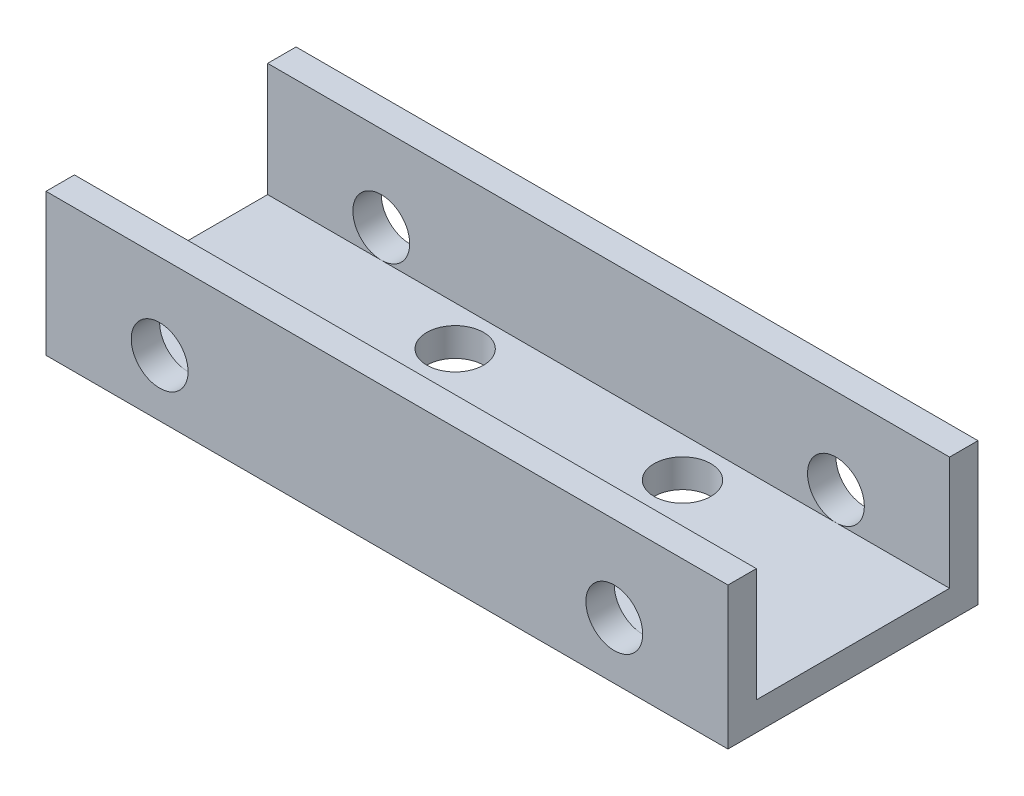
ISO-10303-21;
HEADER;
FILE_DESCRIPTION(('STEP AP214'),'2;1');
FILE_NAME('part.step','',(''),(''),'','','');
FILE_SCHEMA(('AUTOMOTIVE_DESIGN { 1 0 10303 214 1 1 1 1 }'));
ENDSEC;
DATA;
#1=APPLICATION_CONTEXT('core data for automotive mechanical design processes');
#2=APPLICATION_PROTOCOL_DEFINITION('international standard','automotive_design',2000,#1);
#3=PRODUCT_CONTEXT('',#1,'mechanical');
#4=PRODUCT('Part','Part','',(#3));
#5=PRODUCT_RELATED_PRODUCT_CATEGORY('part','',(#4));
#6=PRODUCT_DEFINITION_FORMATION('','',#4);
#7=PRODUCT_DEFINITION_CONTEXT('part definition',#1,'design');
#8=PRODUCT_DEFINITION('design','',#6,#7);
#9=PRODUCT_DEFINITION_SHAPE('','',#8);
#10=(LENGTH_UNIT() NAMED_UNIT(*) SI_UNIT(.MILLI.,.METRE.));
#11=(NAMED_UNIT(*) PLANE_ANGLE_UNIT() SI_UNIT($,.RADIAN.));
#12=(NAMED_UNIT(*) SI_UNIT($,.STERADIAN.) SOLID_ANGLE_UNIT());
#13=UNCERTAINTY_MEASURE_WITH_UNIT(LENGTH_MEASURE(1.E-05),#10,'distance_accuracy_value','');
#14=(GEOMETRIC_REPRESENTATION_CONTEXT(3) GLOBAL_UNCERTAINTY_ASSIGNED_CONTEXT((#13)) GLOBAL_UNIT_ASSIGNED_CONTEXT((#10,
#11,#12)) REPRESENTATION_CONTEXT('',''));
#15=CARTESIAN_POINT('',(0.,0.,0.));
#16=DIRECTION('',(0.,0.,1.));
#17=DIRECTION('',(1.,0.,0.));
#18=AXIS2_PLACEMENT_3D('',#15,#16,#17);
#19=CARTESIAN_POINT('',(0.,5.,0.));
#20=DIRECTION('',(0.,1.,0.));
#21=DIRECTION('',(0.,0.,1.));
#22=AXIS2_PLACEMENT_3D('',#19,#20,#21);
#23=PLANE('',#22);
#24=CARTESIAN_POINT('',(20.,5.,-10.));
#25=DIRECTION('',(0.,1.,0.));
#26=DIRECTION('',(0.,0.,1.));
#27=AXIS2_PLACEMENT_3D('',#24,#25,#26);
#28=CIRCLE('',#27,5.);
#29=CARTESIAN_POINT('',(20.,5.,-5.00000000000002));
#30=VERTEX_POINT('',#29);
#31=EDGE_CURVE('E383',#30,#30,#28,.T.);
#32=ORIENTED_EDGE('',*,*,#31,.F.);
#33=EDGE_LOOP('',(#32));
#34=FACE_BOUND('',#33,.T.);
#35=CARTESIAN_POINT('',(20.,5.,9.99999999999999));
#36=DIRECTION('',(0.,1.,0.));
#37=DIRECTION('',(0.,0.,1.));
#38=AXIS2_PLACEMENT_3D('',#35,#36,#37);
#39=CIRCLE('',#38,5.);
#40=CARTESIAN_POINT('',(20.,5.,15.));
#41=VERTEX_POINT('',#40);
#42=EDGE_CURVE('E387',#41,#41,#39,.T.);
#43=ORIENTED_EDGE('',*,*,#42,.F.);
#44=EDGE_LOOP('',(#43));
#45=FACE_BOUND('',#44,.T.);
#46=CARTESIAN_POINT('',(-20.,5.,10.));
#47=DIRECTION('',(0.,1.,0.));
#48=DIRECTION('',(0.,0.,1.));
#49=AXIS2_PLACEMENT_3D('',#46,#47,#48);
#50=CIRCLE('',#49,5.);
#51=CARTESIAN_POINT('',(-20.,5.,15.));
#52=VERTEX_POINT('',#51);
#53=EDGE_CURVE('E395',#52,#52,#50,.T.);
#54=ORIENTED_EDGE('',*,*,#53,.F.);
#55=EDGE_LOOP('',(#54));
#56=FACE_BOUND('',#55,.T.);
#57=CARTESIAN_POINT('',(-20.,5.,-10.));
#58=DIRECTION('',(0.,1.,0.));
#59=DIRECTION('',(0.,0.,1.));
#60=AXIS2_PLACEMENT_3D('',#57,#58,#59);
#61=CIRCLE('',#60,5.);
#62=CARTESIAN_POINT('',(-20.,5.,-5.00000000000001));
#63=VERTEX_POINT('',#62);
#64=EDGE_CURVE('E199',#63,#63,#61,.T.);
#65=ORIENTED_EDGE('',*,*,#64,.F.);
#66=EDGE_LOOP('',(#65));
#67=FACE_BOUND('',#66,.T.);
#68=DIRECTION('',(-1.,0.,0.));
#69=VECTOR('',#68,1.);
#70=CARTESIAN_POINT('',(60.,5.,17.));
#71=LINE('',#70,#69);
#72=CARTESIAN_POINT('',(-40.,5.,17.));
#73=VERTEX_POINT('',#72);
#74=CARTESIAN_POINT('',(-60.,5.,17.));
#75=VERTEX_POINT('',#74);
#76=EDGE_CURVE('E138',#73,#75,#71,.T.);
#77=ORIENTED_EDGE('',*,*,#76,.F.);
#78=CARTESIAN_POINT('',(40.,5.,17.));
#79=VERTEX_POINT('',#78);
#80=EDGE_CURVE('E141',#79,#73,#71,.T.);
#81=ORIENTED_EDGE('',*,*,#80,.F.);
#82=CARTESIAN_POINT('',(60.,5.,17.));
#83=VERTEX_POINT('',#82);
#84=EDGE_CURVE('E143',#83,#79,#71,.T.);
#85=ORIENTED_EDGE('',*,*,#84,.F.);
#86=DIRECTION('',(0.,0.,-1.));
#87=VECTOR('',#86,1.);
#88=CARTESIAN_POINT('',(60.,5.,-22.));
#89=LINE('',#88,#87);
#90=CARTESIAN_POINT('',(60.,5.,-17.));
#91=VERTEX_POINT('',#90);
#92=EDGE_CURVE('E171',#83,#91,#89,.T.);
#93=ORIENTED_EDGE('',*,*,#92,.T.);
#94=DIRECTION('',(-1.,0.,0.));
#95=VECTOR('',#94,1.);
#96=CARTESIAN_POINT('',(60.,5.,-17.));
#97=LINE('',#96,#95);
#98=CARTESIAN_POINT('',(40.,5.,-17.));
#99=VERTEX_POINT('',#98);
#100=EDGE_CURVE('E151',#91,#99,#97,.T.);
#101=ORIENTED_EDGE('',*,*,#100,.T.);
#102=CARTESIAN_POINT('',(-40.,5.,-17.));
#103=VERTEX_POINT('',#102);
#104=EDGE_CURVE('E163',#99,#103,#97,.T.);
#105=ORIENTED_EDGE('',*,*,#104,.T.);
#106=CARTESIAN_POINT('',(-60.,5.,-17.));
#107=VERTEX_POINT('',#106);
#108=EDGE_CURVE('E164',#103,#107,#97,.T.);
#109=ORIENTED_EDGE('',*,*,#108,.T.);
#110=DIRECTION('',(0.,0.,1.));
#111=VECTOR('',#110,1.);
#112=CARTESIAN_POINT('',(-60.,5.,-22.));
#113=LINE('',#112,#111);
#114=EDGE_CURVE('E123',#107,#75,#113,.T.);
#115=ORIENTED_EDGE('',*,*,#114,.T.);
#116=EDGE_LOOP('',(#77,#81,#85,#93,#101,#105,#109,#115));
#117=FACE_BOUND('',#116,.T.);
#118=ADVANCED_FACE('F34',(#34,#45,#56,#67,#117),#23,.T.);
#119=CARTESIAN_POINT('',(60.,5.,-22.));
#120=DIRECTION('',(-1.,0.,0.));
#121=DIRECTION('',(0.,0.,1.));
#122=AXIS2_PLACEMENT_3D('',#119,#120,#121);
#123=PLANE('',#122);
#124=DIRECTION('',(0.,0.,-1.));
#125=VECTOR('',#124,1.);
#126=CARTESIAN_POINT('',(60.,0.,-22.));
#127=LINE('',#126,#125);
#128=CARTESIAN_POINT('',(60.,0.,22.));
#129=VERTEX_POINT('',#128);
#130=CARTESIAN_POINT('',(60.,0.,-22.));
#131=VERTEX_POINT('',#130);
#132=EDGE_CURVE('E168',#129,#131,#127,.T.);
#133=ORIENTED_EDGE('',*,*,#132,.T.);
#134=DIRECTION('',(0.,-1.,0.));
#135=VECTOR('',#134,1.);
#136=CARTESIAN_POINT('',(60.,5.,-22.));
#137=LINE('',#136,#135);
#138=CARTESIAN_POINT('',(60.,25.,-22.));
#139=VERTEX_POINT('',#138);
#140=EDGE_CURVE('E11',#139,#131,#137,.T.);
#141=ORIENTED_EDGE('',*,*,#140,.F.);
#142=DIRECTION('',(0.,0.,1.));
#143=VECTOR('',#142,1.);
#144=CARTESIAN_POINT('',(60.,25.,-22.));
#145=LINE('',#144,#143);
#146=CARTESIAN_POINT('',(60.,25.,-17.));
#147=VERTEX_POINT('',#146);
#148=EDGE_CURVE('E157',#139,#147,#145,.T.);
#149=ORIENTED_EDGE('',*,*,#148,.T.);
#150=DIRECTION('',(0.,-1.,0.));
#151=VECTOR('',#150,1.);
#152=CARTESIAN_POINT('',(60.,25.,-17.));
#153=LINE('',#152,#151);
#154=EDGE_CURVE('E165',#147,#91,#153,.T.);
#155=ORIENTED_EDGE('',*,*,#154,.T.);
#156=ORIENTED_EDGE('',*,*,#92,.F.);
#157=DIRECTION('',(0.,-1.,0.));
#158=VECTOR('',#157,1.);
#159=CARTESIAN_POINT('',(60.,25.,17.));
#160=LINE('',#159,#158);
#161=CARTESIAN_POINT('',(60.,25.,17.));
#162=VERTEX_POINT('',#161);
#163=EDGE_CURVE('E137',#162,#83,#160,.T.);
#164=ORIENTED_EDGE('',*,*,#163,.F.);
#165=DIRECTION('',(0.,0.,-1.));
#166=VECTOR('',#165,1.);
#167=CARTESIAN_POINT('',(60.,25.,22.));
#168=LINE('',#167,#166);
#169=CARTESIAN_POINT('',(60.,25.,22.));
#170=VERTEX_POINT('',#169);
#171=EDGE_CURVE('E129',#170,#162,#168,.T.);
#172=ORIENTED_EDGE('',*,*,#171,.F.);
#173=DIRECTION('',(0.,-1.,0.));
#174=VECTOR('',#173,1.);
#175=CARTESIAN_POINT('',(60.,5.,22.));
#176=LINE('',#175,#174);
#177=EDGE_CURVE('E111',#170,#129,#176,.T.);
#178=ORIENTED_EDGE('',*,*,#177,.T.);
#179=EDGE_LOOP('',(#133,#141,#149,#155,#156,#164,#172,#178));
#180=FACE_BOUND('',#179,.T.);
#181=ADVANCED_FACE('F36',(#180),#123,.F.);
#182=CARTESIAN_POINT('',(-60.,5.,-22.));
#183=DIRECTION('',(0.,0.,1.));
#184=DIRECTION('',(1.,0.,0.));
#185=AXIS2_PLACEMENT_3D('',#182,#183,#184);
#186=PLANE('',#185);
#187=CARTESIAN_POINT('',(40.,10.,-22.));
#188=DIRECTION('',(0.,0.,1.));
#189=DIRECTION('',(1.,0.,0.));
#190=AXIS2_PLACEMENT_3D('',#187,#188,#189);
#191=CIRCLE('',#190,5.);
#192=CARTESIAN_POINT('',(45.,10.,-22.));
#193=VERTEX_POINT('',#192);
#194=EDGE_CURVE('E185',#193,#193,#191,.T.);
#195=ORIENTED_EDGE('',*,*,#194,.T.);
#196=EDGE_LOOP('',(#195));
#197=FACE_BOUND('',#196,.T.);
#198=CARTESIAN_POINT('',(-40.,10.,-22.));
#199=DIRECTION('',(0.,0.,1.));
#200=DIRECTION('',(1.,0.,0.));
#201=AXIS2_PLACEMENT_3D('',#198,#199,#200);
#202=CIRCLE('',#201,5.);
#203=CARTESIAN_POINT('',(-35.,10.,-22.));
#204=VERTEX_POINT('',#203);
#205=EDGE_CURVE('E204',#204,#204,#202,.T.);
#206=ORIENTED_EDGE('',*,*,#205,.T.);
#207=EDGE_LOOP('',(#206));
#208=FACE_BOUND('',#207,.T.);
#209=DIRECTION('',(-1.,0.,0.));
#210=VECTOR('',#209,1.);
#211=CARTESIAN_POINT('',(-60.,0.,-22.));
#212=LINE('',#211,#210);
#213=CARTESIAN_POINT('',(-60.,0.,-22.));
#214=VERTEX_POINT('',#213);
#215=EDGE_CURVE('E176',#131,#214,#212,.T.);
#216=ORIENTED_EDGE('',*,*,#215,.T.);
#217=DIRECTION('',(0.,-1.,0.));
#218=VECTOR('',#217,1.);
#219=CARTESIAN_POINT('',(-60.,5.,-22.));
#220=LINE('',#219,#218);
#221=CARTESIAN_POINT('',(-60.,25.,-22.));
#222=VERTEX_POINT('',#221);
#223=EDGE_CURVE('E43',#222,#214,#220,.T.);
#224=ORIENTED_EDGE('',*,*,#223,.F.);
#225=DIRECTION('',(1.,0.,0.));
#226=VECTOR('',#225,1.);
#227=CARTESIAN_POINT('',(-60.,25.,-22.));
#228=LINE('',#227,#226);
#229=EDGE_CURVE('E154',#222,#139,#228,.T.);
#230=ORIENTED_EDGE('',*,*,#229,.T.);
#231=ORIENTED_EDGE('',*,*,#140,.T.);
#232=EDGE_LOOP('',(#216,#224,#230,#231));
#233=FACE_BOUND('',#232,.T.);
#234=ADVANCED_FACE('F226',(#197,#208,#233),#186,.F.);
#235=CARTESIAN_POINT('',(-60.,5.,-22.));
#236=DIRECTION('',(1.,0.,0.));
#237=DIRECTION('',(0.,0.,-1.));
#238=AXIS2_PLACEMENT_3D('',#235,#236,#237);
#239=PLANE('',#238);
#240=DIRECTION('',(0.,0.,1.));
#241=VECTOR('',#240,1.);
#242=CARTESIAN_POINT('',(-60.,0.,-22.));
#243=LINE('',#242,#241);
#244=CARTESIAN_POINT('',(-60.,0.,22.));
#245=VERTEX_POINT('',#244);
#246=EDGE_CURVE('E178',#214,#245,#243,.T.);
#247=ORIENTED_EDGE('',*,*,#246,.T.);
#248=DIRECTION('',(0.,-1.,0.));
#249=VECTOR('',#248,1.);
#250=CARTESIAN_POINT('',(-60.,5.,22.));
#251=LINE('',#250,#249);
#252=CARTESIAN_POINT('',(-60.,25.,22.));
#253=VERTEX_POINT('',#252);
#254=EDGE_CURVE('E122',#253,#245,#251,.T.);
#255=ORIENTED_EDGE('',*,*,#254,.F.);
#256=DIRECTION('',(0.,0.,1.));
#257=VECTOR('',#256,1.);
#258=CARTESIAN_POINT('',(-60.,25.,17.));
#259=LINE('',#258,#257);
#260=CARTESIAN_POINT('',(-60.,25.,17.));
#261=VERTEX_POINT('',#260);
#262=EDGE_CURVE('E132',#261,#253,#259,.T.);
#263=ORIENTED_EDGE('',*,*,#262,.F.);
#264=DIRECTION('',(0.,-1.,0.));
#265=VECTOR('',#264,1.);
#266=CARTESIAN_POINT('',(-60.,25.,17.));
#267=LINE('',#266,#265);
#268=EDGE_CURVE('E133',#261,#75,#267,.T.);
#269=ORIENTED_EDGE('',*,*,#268,.T.);
#270=ORIENTED_EDGE('',*,*,#114,.F.);
#271=DIRECTION('',(0.,-1.,0.));
#272=VECTOR('',#271,1.);
#273=CARTESIAN_POINT('',(-60.,25.,-17.));
#274=LINE('',#273,#272);
#275=CARTESIAN_POINT('',(-60.,25.,-17.));
#276=VERTEX_POINT('',#275);
#277=EDGE_CURVE('E160',#276,#107,#274,.T.);
#278=ORIENTED_EDGE('',*,*,#277,.F.);
#279=DIRECTION('',(0.,0.,-1.));
#280=VECTOR('',#279,1.);
#281=CARTESIAN_POINT('',(-60.,25.,-17.));
#282=LINE('',#281,#280);
#283=EDGE_CURVE('E150',#276,#222,#282,.T.);
#284=ORIENTED_EDGE('',*,*,#283,.T.);
#285=ORIENTED_EDGE('',*,*,#223,.T.);
#286=EDGE_LOOP('',(#247,#255,#263,#269,#270,#278,#284,#285));
#287=FACE_BOUND('',#286,.T.);
#288=ADVANCED_FACE('F219',(#287),#239,.F.);
#289=CARTESIAN_POINT('',(-60.,5.,22.));
#290=DIRECTION('',(0.,0.,-1.));
#291=DIRECTION('',(-1.,0.,0.));
#292=AXIS2_PLACEMENT_3D('',#289,#290,#291);
#293=PLANE('',#292);
#294=CARTESIAN_POINT('',(40.,10.,22.));
#295=DIRECTION('',(0.,0.,1.));
#296=DIRECTION('',(1.,0.,0.));
#297=AXIS2_PLACEMENT_3D('',#294,#295,#296);
#298=CIRCLE('',#297,5.);
#299=CARTESIAN_POINT('',(45.,10.,22.));
#300=VERTEX_POINT('',#299);
#301=EDGE_CURVE('E191',#300,#300,#298,.T.);
#302=ORIENTED_EDGE('',*,*,#301,.F.);
#303=EDGE_LOOP('',(#302));
#304=FACE_BOUND('',#303,.T.);
#305=CARTESIAN_POINT('',(-40.,10.,22.));
#306=DIRECTION('',(0.,0.,1.));
#307=DIRECTION('',(1.,0.,0.));
#308=AXIS2_PLACEMENT_3D('',#305,#306,#307);
#309=CIRCLE('',#308,5.);
#310=CARTESIAN_POINT('',(-35.,10.,22.));
#311=VERTEX_POINT('',#310);
#312=EDGE_CURVE('E196',#311,#311,#309,.T.);
#313=ORIENTED_EDGE('',*,*,#312,.F.);
#314=EDGE_LOOP('',(#313));
#315=FACE_BOUND('',#314,.T.);
#316=DIRECTION('',(1.,0.,0.));
#317=VECTOR('',#316,1.);
#318=CARTESIAN_POINT('',(-60.,0.,22.));
#319=LINE('',#318,#317);
#320=EDGE_CURVE('E117',#245,#129,#319,.T.);
#321=ORIENTED_EDGE('',*,*,#320,.T.);
#322=ORIENTED_EDGE('',*,*,#177,.F.);
#323=DIRECTION('',(1.,0.,0.));
#324=VECTOR('',#323,1.);
#325=CARTESIAN_POINT('',(-60.,25.,22.));
#326=LINE('',#325,#324);
#327=EDGE_CURVE('E115',#253,#170,#326,.T.);
#328=ORIENTED_EDGE('',*,*,#327,.F.);
#329=ORIENTED_EDGE('',*,*,#254,.T.);
#330=EDGE_LOOP('',(#321,#322,#328,#329));
#331=FACE_BOUND('',#330,.T.);
#332=ADVANCED_FACE('F113',(#304,#315,#331),#293,.F.);
#333=CARTESIAN_POINT('',(0.,0.,0.));
#334=DIRECTION('',(0.,1.,0.));
#335=DIRECTION('',(0.,0.,1.));
#336=AXIS2_PLACEMENT_3D('',#333,#334,#335);
#337=PLANE('',#336);
#338=CARTESIAN_POINT('',(20.,0.,-10.));
#339=DIRECTION('',(0.,1.,0.));
#340=DIRECTION('',(0.,0.,1.));
#341=AXIS2_PLACEMENT_3D('',#338,#339,#340);
#342=CIRCLE('',#341,5.);
#343=CARTESIAN_POINT('',(20.,0.,-5.00000000000002));
#344=VERTEX_POINT('',#343);
#345=EDGE_CURVE('E381',#344,#344,#342,.T.);
#346=ORIENTED_EDGE('',*,*,#345,.T.);
#347=EDGE_LOOP('',(#346));
#348=FACE_BOUND('',#347,.T.);
#349=CARTESIAN_POINT('',(20.,0.,9.99999999999999));
#350=DIRECTION('',(0.,1.,0.));
#351=DIRECTION('',(0.,0.,1.));
#352=AXIS2_PLACEMENT_3D('',#349,#350,#351);
#353=CIRCLE('',#352,5.);
#354=CARTESIAN_POINT('',(20.,0.,15.));
#355=VERTEX_POINT('',#354);
#356=EDGE_CURVE('E384',#355,#355,#353,.T.);
#357=ORIENTED_EDGE('',*,*,#356,.T.);
#358=EDGE_LOOP('',(#357));
#359=FACE_BOUND('',#358,.T.);
#360=CARTESIAN_POINT('',(-20.,0.,10.));
#361=DIRECTION('',(0.,1.,0.));
#362=DIRECTION('',(0.,0.,1.));
#363=AXIS2_PLACEMENT_3D('',#360,#361,#362);
#364=CIRCLE('',#363,5.);
#365=CARTESIAN_POINT('',(-20.,0.,15.));
#366=VERTEX_POINT('',#365);
#367=EDGE_CURVE('E399',#366,#366,#364,.T.);
#368=ORIENTED_EDGE('',*,*,#367,.T.);
#369=EDGE_LOOP('',(#368));
#370=FACE_BOUND('',#369,.T.);
#371=CARTESIAN_POINT('',(-20.,0.,-10.));
#372=DIRECTION('',(0.,1.,0.));
#373=DIRECTION('',(0.,0.,1.));
#374=AXIS2_PLACEMENT_3D('',#371,#372,#373);
#375=CIRCLE('',#374,5.);
#376=CARTESIAN_POINT('',(-20.,0.,-5.00000000000001));
#377=VERTEX_POINT('',#376);
#378=EDGE_CURVE('E206',#377,#377,#375,.T.);
#379=ORIENTED_EDGE('',*,*,#378,.T.);
#380=EDGE_LOOP('',(#379));
#381=FACE_BOUND('',#380,.T.);
#382=ORIENTED_EDGE('',*,*,#132,.F.);
#383=ORIENTED_EDGE('',*,*,#320,.F.);
#384=ORIENTED_EDGE('',*,*,#246,.F.);
#385=ORIENTED_EDGE('',*,*,#215,.F.);
#386=EDGE_LOOP('',(#382,#383,#384,#385));
#387=FACE_BOUND('',#386,.T.);
#388=ADVANCED_FACE('F222',(#348,#359,#370,#381,#387),#337,.F.);
#389=CARTESIAN_POINT('',(60.,25.,-17.));
#390=DIRECTION('',(0.,0.,1.));
#391=DIRECTION('',(1.,0.,0.));
#392=AXIS2_PLACEMENT_3D('',#389,#390,#391);
#393=PLANE('',#392);
#394=ORIENTED_EDGE('',*,*,#104,.F.);
#395=CARTESIAN_POINT('',(40.,10.,-17.));
#396=DIRECTION('',(0.,0.,1.));
#397=DIRECTION('',(1.,0.,0.));
#398=AXIS2_PLACEMENT_3D('',#395,#396,#397);
#399=CIRCLE('',#398,5.);
#400=EDGE_CURVE('E54',#99,#99,#399,.T.);
#401=ORIENTED_EDGE('',*,*,#400,.F.);
#402=ORIENTED_EDGE('',*,*,#100,.F.);
#403=ORIENTED_EDGE('',*,*,#154,.F.);
#404=DIRECTION('',(-1.,0.,0.));
#405=VECTOR('',#404,1.);
#406=CARTESIAN_POINT('',(60.,25.,-17.));
#407=LINE('',#406,#405);
#408=EDGE_CURVE('E147',#147,#276,#407,.T.);
#409=ORIENTED_EDGE('',*,*,#408,.T.);
#410=ORIENTED_EDGE('',*,*,#277,.T.);
#411=ORIENTED_EDGE('',*,*,#108,.F.);
#412=CARTESIAN_POINT('',(-40.,10.,-17.));
#413=DIRECTION('',(0.,0.,1.));
#414=DIRECTION('',(1.,0.,0.));
#415=AXIS2_PLACEMENT_3D('',#412,#413,#414);
#416=CIRCLE('',#415,5.);
#417=EDGE_CURVE('E49',#103,#103,#416,.T.);
#418=ORIENTED_EDGE('',*,*,#417,.F.);
#419=EDGE_LOOP('',(#394,#401,#402,#403,#409,#410,#411,#418));
#420=FACE_BOUND('',#419,.T.);
#421=ADVANCED_FACE('F233',(#420),#393,.T.);
#422=CARTESIAN_POINT('',(0.,25.,0.));
#423=DIRECTION('',(0.,-1.,0.));
#424=DIRECTION('',(0.,0.,-1.));
#425=AXIS2_PLACEMENT_3D('',#422,#423,#424);
#426=PLANE('',#425);
#427=ORIENTED_EDGE('',*,*,#408,.F.);
#428=ORIENTED_EDGE('',*,*,#148,.F.);
#429=ORIENTED_EDGE('',*,*,#229,.F.);
#430=ORIENTED_EDGE('',*,*,#283,.F.);
#431=EDGE_LOOP('',(#427,#428,#429,#430));
#432=FACE_BOUND('',#431,.T.);
#433=ADVANCED_FACE('F230',(#432),#426,.F.);
#434=CARTESIAN_POINT('',(60.,25.,17.));
#435=DIRECTION('',(0.,0.,1.));
#436=DIRECTION('',(1.,0.,0.));
#437=AXIS2_PLACEMENT_3D('',#434,#435,#436);
#438=PLANE('',#437);
#439=ORIENTED_EDGE('',*,*,#84,.T.);
#440=CARTESIAN_POINT('',(40.,10.,17.));
#441=DIRECTION('',(0.,0.,1.));
#442=DIRECTION('',(1.,0.,0.));
#443=AXIS2_PLACEMENT_3D('',#440,#441,#442);
#444=CIRCLE('',#443,5.);
#445=EDGE_CURVE('E38',#79,#79,#444,.T.);
#446=ORIENTED_EDGE('',*,*,#445,.T.);
#447=ORIENTED_EDGE('',*,*,#80,.T.);
#448=CARTESIAN_POINT('',(-40.,10.,17.));
#449=DIRECTION('',(0.,0.,1.));
#450=DIRECTION('',(1.,0.,0.));
#451=AXIS2_PLACEMENT_3D('',#448,#449,#450);
#452=CIRCLE('',#451,5.);
#453=EDGE_CURVE('E183',#73,#73,#452,.T.);
#454=ORIENTED_EDGE('',*,*,#453,.T.);
#455=ORIENTED_EDGE('',*,*,#76,.T.);
#456=ORIENTED_EDGE('',*,*,#268,.F.);
#457=DIRECTION('',(-1.,0.,0.));
#458=VECTOR('',#457,1.);
#459=CARTESIAN_POINT('',(60.,25.,17.));
#460=LINE('',#459,#458);
#461=EDGE_CURVE('E139',#162,#261,#460,.T.);
#462=ORIENTED_EDGE('',*,*,#461,.F.);
#463=ORIENTED_EDGE('',*,*,#163,.T.);
#464=EDGE_LOOP('',(#439,#446,#447,#454,#455,#456,#462,#463));
#465=FACE_BOUND('',#464,.T.);
#466=ADVANCED_FACE('F214',(#465),#438,.F.);
#467=CARTESIAN_POINT('',(0.,25.,0.));
#468=DIRECTION('',(0.,1.,0.));
#469=DIRECTION('',(0.,0.,1.));
#470=AXIS2_PLACEMENT_3D('',#467,#468,#469);
#471=PLANE('',#470);
#472=ORIENTED_EDGE('',*,*,#171,.T.);
#473=ORIENTED_EDGE('',*,*,#461,.T.);
#474=ORIENTED_EDGE('',*,*,#262,.T.);
#475=ORIENTED_EDGE('',*,*,#327,.T.);
#476=EDGE_LOOP('',(#472,#473,#474,#475));
#477=FACE_BOUND('',#476,.T.);
#478=ADVANCED_FACE('F128',(#477),#471,.T.);
#479=CARTESIAN_POINT('',(-40.,10.,-22.));
#480=DIRECTION('',(0.,0.,1.));
#481=DIRECTION('',(1.,0.,0.));
#482=AXIS2_PLACEMENT_3D('',#479,#480,#481);
#483=CYLINDRICAL_SURFACE('',#482,5.);
#484=ORIENTED_EDGE('',*,*,#312,.T.);
#485=EDGE_LOOP('',(#484));
#486=FACE_BOUND('',#485,.T.);
#487=ORIENTED_EDGE('',*,*,#453,.F.);
#488=EDGE_LOOP('',(#487));
#489=FACE_BOUND('',#488,.T.);
#490=ADVANCED_FACE('F270',(#486,#489),#483,.F.);
#491=CARTESIAN_POINT('',(40.,10.,-22.));
#492=DIRECTION('',(0.,0.,1.));
#493=DIRECTION('',(1.,0.,0.));
#494=AXIS2_PLACEMENT_3D('',#491,#492,#493);
#495=CYLINDRICAL_SURFACE('',#494,5.);
#496=ORIENTED_EDGE('',*,*,#301,.T.);
#497=EDGE_LOOP('',(#496));
#498=FACE_BOUND('',#497,.T.);
#499=ORIENTED_EDGE('',*,*,#445,.F.);
#500=EDGE_LOOP('',(#499));
#501=FACE_BOUND('',#500,.T.);
#502=ADVANCED_FACE('F268',(#498,#501),#495,.F.);
#503=ORIENTED_EDGE('',*,*,#417,.T.);
#504=EDGE_LOOP('',(#503));
#505=FACE_BOUND('',#504,.T.);
#506=ORIENTED_EDGE('',*,*,#205,.F.);
#507=EDGE_LOOP('',(#506));
#508=FACE_BOUND('',#507,.T.);
#509=ADVANCED_FACE('F265',(#505,#508),#483,.F.);
#510=ORIENTED_EDGE('',*,*,#400,.T.);
#511=EDGE_LOOP('',(#510));
#512=FACE_BOUND('',#511,.T.);
#513=ORIENTED_EDGE('',*,*,#194,.F.);
#514=EDGE_LOOP('',(#513));
#515=FACE_BOUND('',#514,.T.);
#516=ADVANCED_FACE('F267',(#512,#515),#495,.F.);
#517=CARTESIAN_POINT('',(-20.,0.,-10.));
#518=DIRECTION('',(0.,1.,0.));
#519=DIRECTION('',(0.,0.,1.));
#520=AXIS2_PLACEMENT_3D('',#517,#518,#519);
#521=CYLINDRICAL_SURFACE('',#520,5.);
#522=ORIENTED_EDGE('',*,*,#378,.F.);
#523=EDGE_LOOP('',(#522));
#524=FACE_BOUND('',#523,.T.);
#525=ORIENTED_EDGE('',*,*,#64,.T.);
#526=EDGE_LOOP('',(#525));
#527=FACE_BOUND('',#526,.T.);
#528=ADVANCED_FACE('F275',(#524,#527),#521,.F.);
#529=CARTESIAN_POINT('',(-20.,0.,10.));
#530=DIRECTION('',(0.,1.,0.));
#531=DIRECTION('',(0.,0.,1.));
#532=AXIS2_PLACEMENT_3D('',#529,#530,#531);
#533=CYLINDRICAL_SURFACE('',#532,5.);
#534=ORIENTED_EDGE('',*,*,#367,.F.);
#535=EDGE_LOOP('',(#534));
#536=FACE_BOUND('',#535,.T.);
#537=ORIENTED_EDGE('',*,*,#53,.T.);
#538=EDGE_LOOP('',(#537));
#539=FACE_BOUND('',#538,.T.);
#540=ADVANCED_FACE('F343',(#536,#539),#533,.F.);
#541=CARTESIAN_POINT('',(20.,0.,9.99999999999999));
#542=DIRECTION('',(0.,1.,0.));
#543=DIRECTION('',(0.,0.,1.));
#544=AXIS2_PLACEMENT_3D('',#541,#542,#543);
#545=CYLINDRICAL_SURFACE('',#544,5.);
#546=ORIENTED_EDGE('',*,*,#356,.F.);
#547=EDGE_LOOP('',(#546));
#548=FACE_BOUND('',#547,.T.);
#549=ORIENTED_EDGE('',*,*,#42,.T.);
#550=EDGE_LOOP('',(#549));
#551=FACE_BOUND('',#550,.T.);
#552=ADVANCED_FACE('F354',(#548,#551),#545,.F.);
#553=CARTESIAN_POINT('',(20.,0.,-10.));
#554=DIRECTION('',(0.,1.,0.));
#555=DIRECTION('',(0.,0.,1.));
#556=AXIS2_PLACEMENT_3D('',#553,#554,#555);
#557=CYLINDRICAL_SURFACE('',#556,5.);
#558=ORIENTED_EDGE('',*,*,#345,.F.);
#559=EDGE_LOOP('',(#558));
#560=FACE_BOUND('',#559,.T.);
#561=ORIENTED_EDGE('',*,*,#31,.T.);
#562=EDGE_LOOP('',(#561));
#563=FACE_BOUND('',#562,.T.);
#564=ADVANCED_FACE('F364',(#560,#563),#557,.F.);
#565=CLOSED_SHELL('',(#118,#181,#234,#288,#332,#388,#421,#433,#466,#478,#490,#502,#509,#516,
#528,#540,#552,#564));
#566=MANIFOLD_SOLID_BREP('B2',#565);
#567=ADVANCED_BREP_SHAPE_REPRESENTATION('',(#18,#566),#14);
#568=SHAPE_DEFINITION_REPRESENTATION(#9,#567);
ENDSEC;
END-ISO-10303-21;
